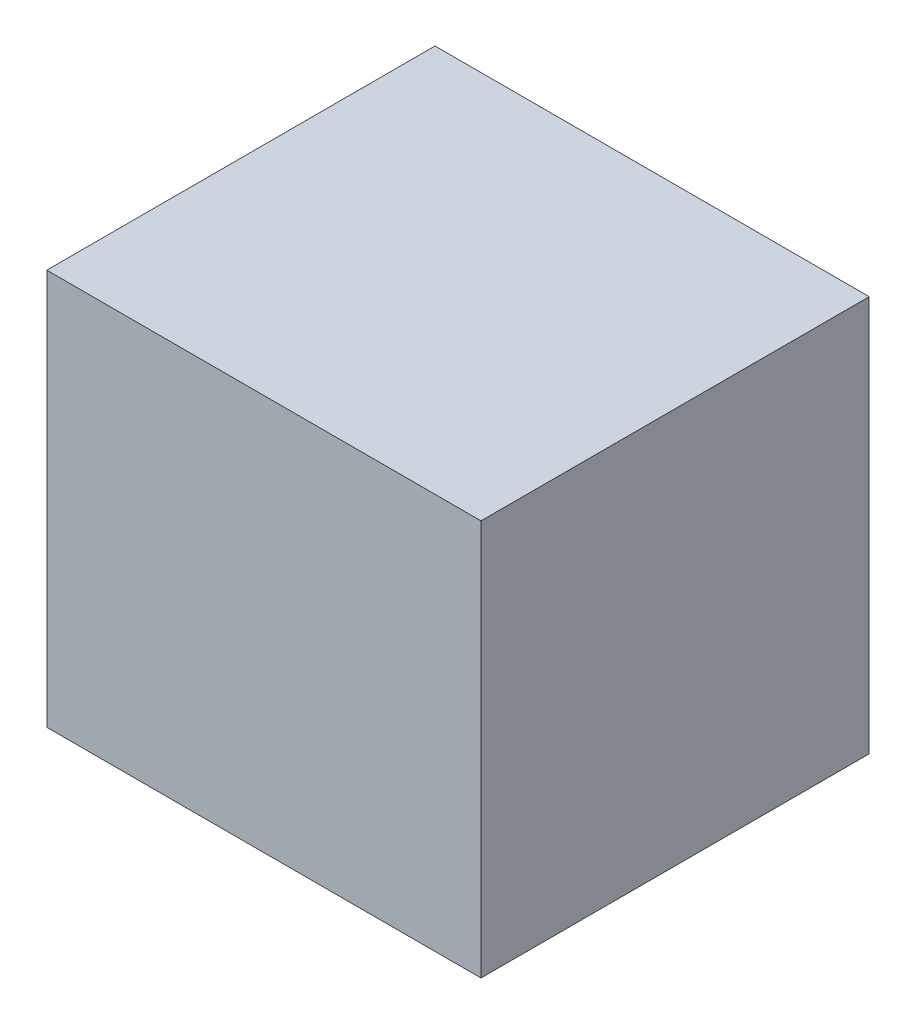
ISO-10303-21;
HEADER;
FILE_DESCRIPTION(('STEP AP214'),'2;1');
FILE_NAME('part.step','',(''),(''),'','','');
FILE_SCHEMA(('AUTOMOTIVE_DESIGN { 1 0 10303 214 1 1 1 1 }'));
ENDSEC;
DATA;
#1=APPLICATION_CONTEXT('core data for automotive mechanical design processes');
#2=APPLICATION_PROTOCOL_DEFINITION('international standard','automotive_design',2000,#1);
#3=PRODUCT_CONTEXT('',#1,'mechanical');
#4=PRODUCT('Part','Part','',(#3));
#5=PRODUCT_RELATED_PRODUCT_CATEGORY('part','',(#4));
#6=PRODUCT_DEFINITION_FORMATION('','',#4);
#7=PRODUCT_DEFINITION_CONTEXT('part definition',#1,'design');
#8=PRODUCT_DEFINITION('design','',#6,#7);
#9=PRODUCT_DEFINITION_SHAPE('','',#8);
#10=(LENGTH_UNIT() NAMED_UNIT(*) SI_UNIT(.MILLI.,.METRE.));
#11=(NAMED_UNIT(*) PLANE_ANGLE_UNIT() SI_UNIT($,.RADIAN.));
#12=(NAMED_UNIT(*) SI_UNIT($,.STERADIAN.) SOLID_ANGLE_UNIT());
#13=UNCERTAINTY_MEASURE_WITH_UNIT(LENGTH_MEASURE(1.E-05),#10,'distance_accuracy_value','');
#14=(GEOMETRIC_REPRESENTATION_CONTEXT(3) GLOBAL_UNCERTAINTY_ASSIGNED_CONTEXT((#13)) GLOBAL_UNIT_ASSIGNED_CONTEXT((#10,
#11,#12)) REPRESENTATION_CONTEXT('',''));
#15=CARTESIAN_POINT('',(0.,0.,0.));
#16=DIRECTION('',(0.,0.,1.));
#17=DIRECTION('',(1.,0.,0.));
#18=AXIS2_PLACEMENT_3D('',#15,#16,#17);
#19=CARTESIAN_POINT('',(44.5,8.75,15.2));
#20=DIRECTION('',(-1.,0.,0.));
#21=DIRECTION('',(0.,0.,1.));
#22=AXIS2_PLACEMENT_3D('',#19,#20,#21);
#23=PLANE('',#22);
#24=DIRECTION('',(0.,1.,0.));
#25=VECTOR('',#24,1.);
#26=CARTESIAN_POINT('',(44.5,8.75,0.));
#27=LINE('',#26,#25);
#28=CARTESIAN_POINT('',(44.5,-6.75,0.));
#29=VERTEX_POINT('',#28);
#30=CARTESIAN_POINT('',(44.5,8.75,0.));
#31=VERTEX_POINT('',#30);
#32=EDGE_CURVE('E96',#29,#31,#27,.T.);
#33=ORIENTED_EDGE('',*,*,#32,.T.);
#34=DIRECTION('',(0.,0.,-1.));
#35=VECTOR('',#34,1.);
#36=CARTESIAN_POINT('',(44.5,8.75,15.2));
#37=LINE('',#36,#35);
#38=CARTESIAN_POINT('',(44.5,8.75,15.2));
#39=VERTEX_POINT('',#38);
#40=EDGE_CURVE('E11',#39,#31,#37,.T.);
#41=ORIENTED_EDGE('',*,*,#40,.F.);
#42=DIRECTION('',(0.,1.,0.));
#43=VECTOR('',#42,1.);
#44=CARTESIAN_POINT('',(44.5,8.75,15.2));
#45=LINE('',#44,#43);
#46=CARTESIAN_POINT('',(44.5,-6.75,15.2));
#47=VERTEX_POINT('',#46);
#48=EDGE_CURVE('E84',#47,#39,#45,.T.);
#49=ORIENTED_EDGE('',*,*,#48,.F.);
#50=DIRECTION('',(0.,0.,-1.));
#51=VECTOR('',#50,1.);
#52=CARTESIAN_POINT('',(44.5,-6.75,15.2));
#53=LINE('',#52,#51);
#54=EDGE_CURVE('E92',#47,#29,#53,.T.);
#55=ORIENTED_EDGE('',*,*,#54,.T.);
#56=EDGE_LOOP('',(#33,#41,#49,#55));
#57=FACE_BOUND('',#56,.T.);
#58=ADVANCED_FACE('F33',(#57),#23,.F.);
#59=CARTESIAN_POINT('',(27.5,8.75,15.2));
#60=DIRECTION('',(0.,-1.,0.));
#61=DIRECTION('',(0.,0.,-1.));
#62=AXIS2_PLACEMENT_3D('',#59,#60,#61);
#63=PLANE('',#62);
#64=DIRECTION('',(-1.,0.,0.));
#65=VECTOR('',#64,1.);
#66=CARTESIAN_POINT('',(27.5,8.75,0.));
#67=LINE('',#66,#65);
#68=CARTESIAN_POINT('',(27.5,8.75,0.));
#69=VERTEX_POINT('',#68);
#70=EDGE_CURVE('E88',#31,#69,#67,.T.);
#71=ORIENTED_EDGE('',*,*,#70,.T.);
#72=DIRECTION('',(0.,0.,-1.));
#73=VECTOR('',#72,1.);
#74=CARTESIAN_POINT('',(27.5,8.75,15.2));
#75=LINE('',#74,#73);
#76=CARTESIAN_POINT('',(27.5,8.75,15.2));
#77=VERTEX_POINT('',#76);
#78=EDGE_CURVE('E41',#77,#69,#75,.T.);
#79=ORIENTED_EDGE('',*,*,#78,.F.);
#80=DIRECTION('',(-1.,0.,0.));
#81=VECTOR('',#80,1.);
#82=CARTESIAN_POINT('',(27.5,8.75,15.2));
#83=LINE('',#82,#81);
#84=EDGE_CURVE('E79',#39,#77,#83,.T.);
#85=ORIENTED_EDGE('',*,*,#84,.F.);
#86=ORIENTED_EDGE('',*,*,#40,.T.);
#87=EDGE_LOOP('',(#71,#79,#85,#86));
#88=FACE_BOUND('',#87,.T.);
#89=ADVANCED_FACE('F87',(#88),#63,.F.);
#90=CARTESIAN_POINT('',(27.5,8.75,15.2));
#91=DIRECTION('',(1.,0.,0.));
#92=DIRECTION('',(0.,1.,0.));
#93=AXIS2_PLACEMENT_3D('',#90,#91,#92);
#94=PLANE('',#93);
#95=DIRECTION('',(0.,-1.,0.));
#96=VECTOR('',#95,1.);
#97=CARTESIAN_POINT('',(27.5,8.75,0.));
#98=LINE('',#97,#96);
#99=CARTESIAN_POINT('',(27.5,-6.75,0.));
#100=VERTEX_POINT('',#99);
#101=EDGE_CURVE('E66',#69,#100,#98,.T.);
#102=ORIENTED_EDGE('',*,*,#101,.T.);
#103=DIRECTION('',(0.,0.,-1.));
#104=VECTOR('',#103,1.);
#105=CARTESIAN_POINT('',(27.5,-6.75,15.2));
#106=LINE('',#105,#104);
#107=CARTESIAN_POINT('',(27.5,-6.75,15.2));
#108=VERTEX_POINT('',#107);
#109=EDGE_CURVE('E89',#108,#100,#106,.T.);
#110=ORIENTED_EDGE('',*,*,#109,.F.);
#111=DIRECTION('',(0.,-1.,0.));
#112=VECTOR('',#111,1.);
#113=CARTESIAN_POINT('',(27.5,8.75,15.2));
#114=LINE('',#113,#112);
#115=EDGE_CURVE('E82',#77,#108,#114,.T.);
#116=ORIENTED_EDGE('',*,*,#115,.F.);
#117=ORIENTED_EDGE('',*,*,#78,.T.);
#118=EDGE_LOOP('',(#102,#110,#116,#117));
#119=FACE_BOUND('',#118,.T.);
#120=ADVANCED_FACE('F90',(#119),#94,.F.);
#121=CARTESIAN_POINT('',(27.5,-6.75,15.2));
#122=DIRECTION('',(0.,1.,0.));
#123=DIRECTION('',(0.,0.,1.));
#124=AXIS2_PLACEMENT_3D('',#121,#122,#123);
#125=PLANE('',#124);
#126=DIRECTION('',(1.,0.,0.));
#127=VECTOR('',#126,1.);
#128=CARTESIAN_POINT('',(27.5,-6.75,0.));
#129=LINE('',#128,#127);
#130=EDGE_CURVE('E72',#100,#29,#129,.T.);
#131=ORIENTED_EDGE('',*,*,#130,.T.);
#132=ORIENTED_EDGE('',*,*,#54,.F.);
#133=DIRECTION('',(1.,0.,0.));
#134=VECTOR('',#133,1.);
#135=CARTESIAN_POINT('',(27.5,-6.75,15.2));
#136=LINE('',#135,#134);
#137=EDGE_CURVE('E49',#108,#47,#136,.T.);
#138=ORIENTED_EDGE('',*,*,#137,.F.);
#139=ORIENTED_EDGE('',*,*,#109,.T.);
#140=EDGE_LOOP('',(#131,#132,#138,#139));
#141=FACE_BOUND('',#140,.T.);
#142=ADVANCED_FACE('F103',(#141),#125,.F.);
#143=CARTESIAN_POINT('',(0.,0.,15.2));
#144=DIRECTION('',(0.,0.,1.));
#145=DIRECTION('',(1.,0.,0.));
#146=AXIS2_PLACEMENT_3D('',#143,#144,#145);
#147=PLANE('',#146);
#148=ORIENTED_EDGE('',*,*,#48,.T.);
#149=ORIENTED_EDGE('',*,*,#84,.T.);
#150=ORIENTED_EDGE('',*,*,#115,.T.);
#151=ORIENTED_EDGE('',*,*,#137,.T.);
#152=EDGE_LOOP('',(#148,#149,#150,#151));
#153=FACE_BOUND('',#152,.T.);
#154=ADVANCED_FACE('F80',(#153),#147,.T.);
#155=CARTESIAN_POINT('',(0.,0.,0.));
#156=DIRECTION('',(0.,0.,1.));
#157=DIRECTION('',(1.,0.,0.));
#158=AXIS2_PLACEMENT_3D('',#155,#156,#157);
#159=PLANE('',#158);
#160=ORIENTED_EDGE('',*,*,#32,.F.);
#161=ORIENTED_EDGE('',*,*,#130,.F.);
#162=ORIENTED_EDGE('',*,*,#101,.F.);
#163=ORIENTED_EDGE('',*,*,#70,.F.);
#164=EDGE_LOOP('',(#160,#161,#162,#163));
#165=FACE_BOUND('',#164,.T.);
#166=ADVANCED_FACE('F106',(#165),#159,.F.);
#167=CLOSED_SHELL('',(#58,#89,#120,#142,#154,#166));
#168=MANIFOLD_SOLID_BREP('B2',#167);
#169=ADVANCED_BREP_SHAPE_REPRESENTATION('',(#18,#168),#14);
#170=SHAPE_DEFINITION_REPRESENTATION(#9,#169);
ENDSEC;
END-ISO-10303-21;
